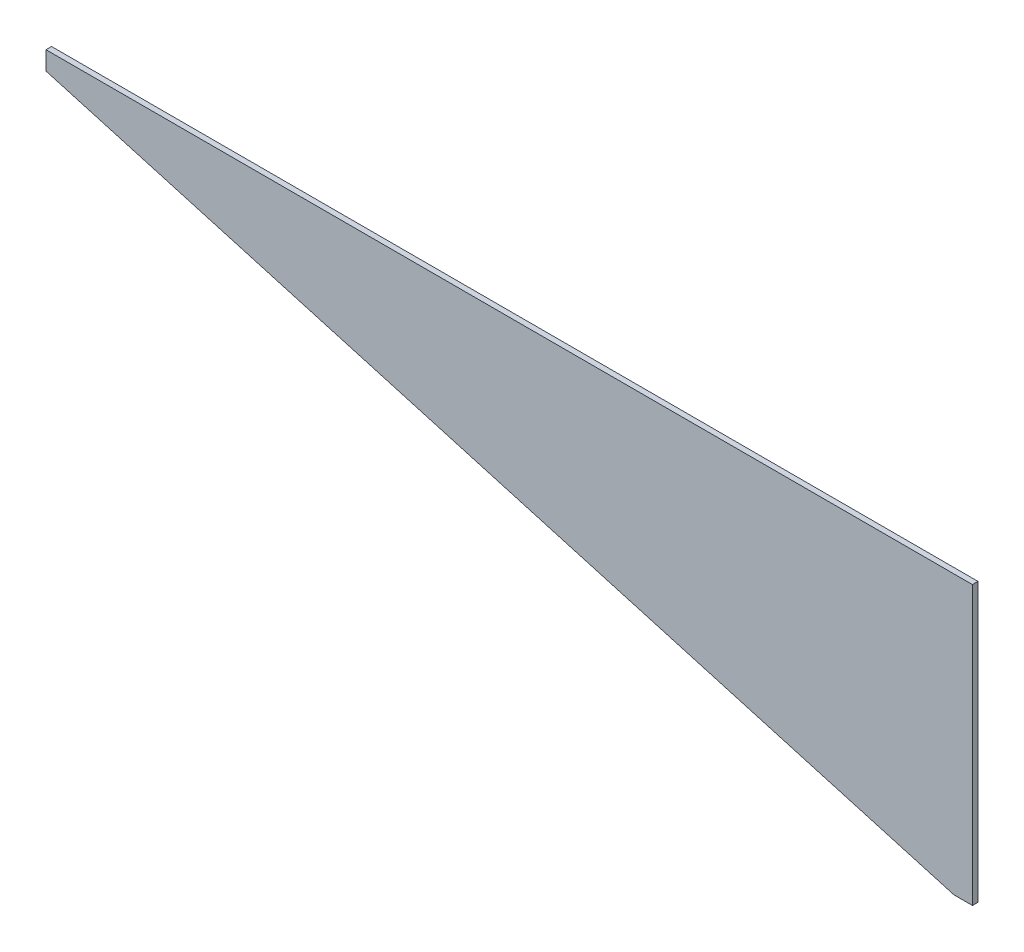
ISO-10303-21;
HEADER;
FILE_DESCRIPTION(('STEP AP214'),'2;1');
FILE_NAME('part.step','',(''),(''),'','','');
FILE_SCHEMA(('AUTOMOTIVE_DESIGN { 1 0 10303 214 1 1 1 1 }'));
ENDSEC;
DATA;
#1=APPLICATION_CONTEXT('core data for automotive mechanical design processes');
#2=APPLICATION_PROTOCOL_DEFINITION('international standard','automotive_design',2000,#1);
#3=PRODUCT_CONTEXT('',#1,'mechanical');
#4=PRODUCT('Part','Part','',(#3));
#5=PRODUCT_RELATED_PRODUCT_CATEGORY('part','',(#4));
#6=PRODUCT_DEFINITION_FORMATION('','',#4);
#7=PRODUCT_DEFINITION_CONTEXT('part definition',#1,'design');
#8=PRODUCT_DEFINITION('design','',#6,#7);
#9=PRODUCT_DEFINITION_SHAPE('','',#8);
#10=(LENGTH_UNIT() NAMED_UNIT(*) SI_UNIT(.MILLI.,.METRE.));
#11=(NAMED_UNIT(*) PLANE_ANGLE_UNIT() SI_UNIT($,.RADIAN.));
#12=(NAMED_UNIT(*) SI_UNIT($,.STERADIAN.) SOLID_ANGLE_UNIT());
#13=UNCERTAINTY_MEASURE_WITH_UNIT(LENGTH_MEASURE(1.E-05),#10,'distance_accuracy_value','');
#14=(GEOMETRIC_REPRESENTATION_CONTEXT(3) GLOBAL_UNCERTAINTY_ASSIGNED_CONTEXT((#13)) GLOBAL_UNIT_ASSIGNED_CONTEXT((#10,
#11,#12)) REPRESENTATION_CONTEXT('',''));
#15=CARTESIAN_POINT('',(0.,0.,0.));
#16=DIRECTION('',(0.,0.,1.));
#17=DIRECTION('',(1.,0.,0.));
#18=AXIS2_PLACEMENT_3D('',#15,#16,#17);
#19=CARTESIAN_POINT('',(-10.,0.,3.));
#20=DIRECTION('',(0.,1.,0.));
#21=DIRECTION('',(0.,0.,1.));
#22=AXIS2_PLACEMENT_3D('',#19,#20,#21);
#23=PLANE('',#22);
#24=DIRECTION('',(1.,0.,0.));
#25=VECTOR('',#24,1.);
#26=CARTESIAN_POINT('',(-10.,0.,0.));
#27=LINE('',#26,#25);
#28=CARTESIAN_POINT('',(-10.,0.,0.));
#29=VERTEX_POINT('',#28);
#30=CARTESIAN_POINT('',(0.,0.,0.));
#31=VERTEX_POINT('',#30);
#32=EDGE_CURVE('E107',#29,#31,#27,.T.);
#33=ORIENTED_EDGE('',*,*,#32,.T.);
#34=DIRECTION('',(0.,0.,-1.));
#35=VECTOR('',#34,1.);
#36=CARTESIAN_POINT('',(0.,0.,3.));
#37=LINE('',#36,#35);
#38=CARTESIAN_POINT('',(0.,0.,3.));
#39=VERTEX_POINT('',#38);
#40=EDGE_CURVE('E11',#39,#31,#37,.T.);
#41=ORIENTED_EDGE('',*,*,#40,.F.);
#42=DIRECTION('',(1.,0.,0.));
#43=VECTOR('',#42,1.);
#44=CARTESIAN_POINT('',(-10.,0.,3.));
#45=LINE('',#44,#43);
#46=CARTESIAN_POINT('',(-10.,0.,3.));
#47=VERTEX_POINT('',#46);
#48=EDGE_CURVE('E115',#47,#39,#45,.T.);
#49=ORIENTED_EDGE('',*,*,#48,.F.);
#50=DIRECTION('',(0.,0.,-1.));
#51=VECTOR('',#50,1.);
#52=CARTESIAN_POINT('',(-10.,0.,3.));
#53=LINE('',#52,#51);
#54=EDGE_CURVE('E103',#47,#29,#53,.T.);
#55=ORIENTED_EDGE('',*,*,#54,.T.);
#56=EDGE_LOOP('',(#33,#41,#49,#55));
#57=FACE_BOUND('',#56,.T.);
#58=ADVANCED_FACE('F33',(#57),#23,.F.);
#59=CARTESIAN_POINT('',(0.,0.,3.));
#60=DIRECTION('',(-1.,0.,0.));
#61=DIRECTION('',(0.,0.,1.));
#62=AXIS2_PLACEMENT_3D('',#59,#60,#61);
#63=PLANE('',#62);
#64=DIRECTION('',(0.,1.,0.));
#65=VECTOR('',#64,1.);
#66=CARTESIAN_POINT('',(0.,0.,0.));
#67=LINE('',#66,#65);
#68=CARTESIAN_POINT('',(0.,150.,0.));
#69=VERTEX_POINT('',#68);
#70=EDGE_CURVE('E110',#31,#69,#67,.T.);
#71=ORIENTED_EDGE('',*,*,#70,.T.);
#72=DIRECTION('',(0.,0.,-1.));
#73=VECTOR('',#72,1.);
#74=CARTESIAN_POINT('',(0.,150.,3.));
#75=LINE('',#74,#73);
#76=CARTESIAN_POINT('',(0.,150.,3.));
#77=VERTEX_POINT('',#76);
#78=EDGE_CURVE('E41',#77,#69,#75,.T.);
#79=ORIENTED_EDGE('',*,*,#78,.F.);
#80=DIRECTION('',(0.,1.,0.));
#81=VECTOR('',#80,1.);
#82=CARTESIAN_POINT('',(0.,0.,3.));
#83=LINE('',#82,#81);
#84=EDGE_CURVE('E83',#39,#77,#83,.T.);
#85=ORIENTED_EDGE('',*,*,#84,.F.);
#86=ORIENTED_EDGE('',*,*,#40,.T.);
#87=EDGE_LOOP('',(#71,#79,#85,#86));
#88=FACE_BOUND('',#87,.T.);
#89=ADVANCED_FACE('F134',(#88),#63,.F.);
#90=CARTESIAN_POINT('',(0.,150.,3.));
#91=DIRECTION('',(0.,-1.,0.));
#92=DIRECTION('',(1.,0.,0.));
#93=AXIS2_PLACEMENT_3D('',#90,#91,#92);
#94=PLANE('',#93);
#95=DIRECTION('',(-1.,0.,0.));
#96=VECTOR('',#95,1.);
#97=CARTESIAN_POINT('',(0.,150.,0.));
#98=LINE('',#97,#96);
#99=CARTESIAN_POINT('',(-500.,150.,0.));
#100=VERTEX_POINT('',#99);
#101=EDGE_CURVE('E98',#69,#100,#98,.T.);
#102=ORIENTED_EDGE('',*,*,#101,.T.);
#103=DIRECTION('',(0.,0.,-1.));
#104=VECTOR('',#103,1.);
#105=CARTESIAN_POINT('',(-500.,150.,3.));
#106=LINE('',#105,#104);
#107=CARTESIAN_POINT('',(-500.,150.,3.));
#108=VERTEX_POINT('',#107);
#109=EDGE_CURVE('E95',#108,#100,#106,.T.);
#110=ORIENTED_EDGE('',*,*,#109,.F.);
#111=DIRECTION('',(-1.,0.,0.));
#112=VECTOR('',#111,1.);
#113=CARTESIAN_POINT('',(0.,150.,3.));
#114=LINE('',#113,#112);
#115=EDGE_CURVE('E87',#77,#108,#114,.T.);
#116=ORIENTED_EDGE('',*,*,#115,.F.);
#117=ORIENTED_EDGE('',*,*,#78,.T.);
#118=EDGE_LOOP('',(#102,#110,#116,#117));
#119=FACE_BOUND('',#118,.T.);
#120=ADVANCED_FACE('F96',(#119),#94,.F.);
#121=CARTESIAN_POINT('',(-500.,150.,3.));
#122=DIRECTION('',(1.,0.,0.));
#123=DIRECTION('',(0.,0.,-1.));
#124=AXIS2_PLACEMENT_3D('',#121,#122,#123);
#125=PLANE('',#124);
#126=DIRECTION('',(0.,-1.,0.));
#127=VECTOR('',#126,1.);
#128=CARTESIAN_POINT('',(-500.,150.,0.));
#129=LINE('',#128,#127);
#130=CARTESIAN_POINT('',(-500.,140.,0.));
#131=VERTEX_POINT('',#130);
#132=EDGE_CURVE('E69',#100,#131,#129,.T.);
#133=ORIENTED_EDGE('',*,*,#132,.T.);
#134=DIRECTION('',(0.,0.,-1.));
#135=VECTOR('',#134,1.);
#136=CARTESIAN_POINT('',(-500.,140.,3.));
#137=LINE('',#136,#135);
#138=CARTESIAN_POINT('',(-500.,140.,3.));
#139=VERTEX_POINT('',#138);
#140=EDGE_CURVE('E99',#139,#131,#137,.T.);
#141=ORIENTED_EDGE('',*,*,#140,.F.);
#142=DIRECTION('',(0.,-1.,0.));
#143=VECTOR('',#142,1.);
#144=CARTESIAN_POINT('',(-500.,150.,3.));
#145=LINE('',#144,#143);
#146=EDGE_CURVE('E91',#108,#139,#145,.T.);
#147=ORIENTED_EDGE('',*,*,#146,.F.);
#148=ORIENTED_EDGE('',*,*,#109,.T.);
#149=EDGE_LOOP('',(#133,#141,#147,#148));
#150=FACE_BOUND('',#149,.T.);
#151=ADVANCED_FACE('F101',(#150),#125,.F.);
#152=CARTESIAN_POINT('',(-500.,140.,3.));
#153=DIRECTION('',(0.274721127897378,0.961523947640823,0.));
#154=DIRECTION('',(-0.961523947640823,0.274721127897378,0.));
#155=AXIS2_PLACEMENT_3D('',#152,#153,#154);
#156=PLANE('',#155);
#157=DIRECTION('',(0.961523947640823,-0.274721127897378,0.));
#158=VECTOR('',#157,1.);
#159=CARTESIAN_POINT('',(-500.,140.,0.));
#160=LINE('',#159,#158);
#161=EDGE_CURVE('E75',#131,#29,#160,.T.);
#162=ORIENTED_EDGE('',*,*,#161,.T.);
#163=ORIENTED_EDGE('',*,*,#54,.F.);
#164=DIRECTION('',(0.961523947640823,-0.274721127897378,0.));
#165=VECTOR('',#164,1.);
#166=CARTESIAN_POINT('',(-500.,140.,3.));
#167=LINE('',#166,#165);
#168=EDGE_CURVE('E49',#139,#47,#167,.T.);
#169=ORIENTED_EDGE('',*,*,#168,.F.);
#170=ORIENTED_EDGE('',*,*,#140,.T.);
#171=EDGE_LOOP('',(#162,#163,#169,#170));
#172=FACE_BOUND('',#171,.T.);
#173=ADVANCED_FACE('F123',(#172),#156,.F.);
#174=CARTESIAN_POINT('',(0.,0.,3.));
#175=DIRECTION('',(0.,0.,1.));
#176=DIRECTION('',(1.,0.,0.));
#177=AXIS2_PLACEMENT_3D('',#174,#175,#176);
#178=PLANE('',#177);
#179=ORIENTED_EDGE('',*,*,#48,.T.);
#180=ORIENTED_EDGE('',*,*,#84,.T.);
#181=ORIENTED_EDGE('',*,*,#115,.T.);
#182=ORIENTED_EDGE('',*,*,#146,.T.);
#183=ORIENTED_EDGE('',*,*,#168,.T.);
#184=EDGE_LOOP('',(#179,#180,#181,#182,#183));
#185=FACE_BOUND('',#184,.T.);
#186=ADVANCED_FACE('F89',(#185),#178,.T.);
#187=CARTESIAN_POINT('',(0.,0.,0.));
#188=DIRECTION('',(0.,0.,1.));
#189=DIRECTION('',(1.,0.,0.));
#190=AXIS2_PLACEMENT_3D('',#187,#188,#189);
#191=PLANE('',#190);
#192=ORIENTED_EDGE('',*,*,#32,.F.);
#193=ORIENTED_EDGE('',*,*,#161,.F.);
#194=ORIENTED_EDGE('',*,*,#132,.F.);
#195=ORIENTED_EDGE('',*,*,#101,.F.);
#196=ORIENTED_EDGE('',*,*,#70,.F.);
#197=EDGE_LOOP('',(#192,#193,#194,#195,#196));
#198=FACE_BOUND('',#197,.T.);
#199=ADVANCED_FACE('F119',(#198),#191,.F.);
#200=CLOSED_SHELL('',(#58,#89,#120,#151,#173,#186,#199));
#201=MANIFOLD_SOLID_BREP('B2',#200);
#202=ADVANCED_BREP_SHAPE_REPRESENTATION('',(#18,#201),#14);
#203=SHAPE_DEFINITION_REPRESENTATION(#9,#202);
ENDSEC;
END-ISO-10303-21;
